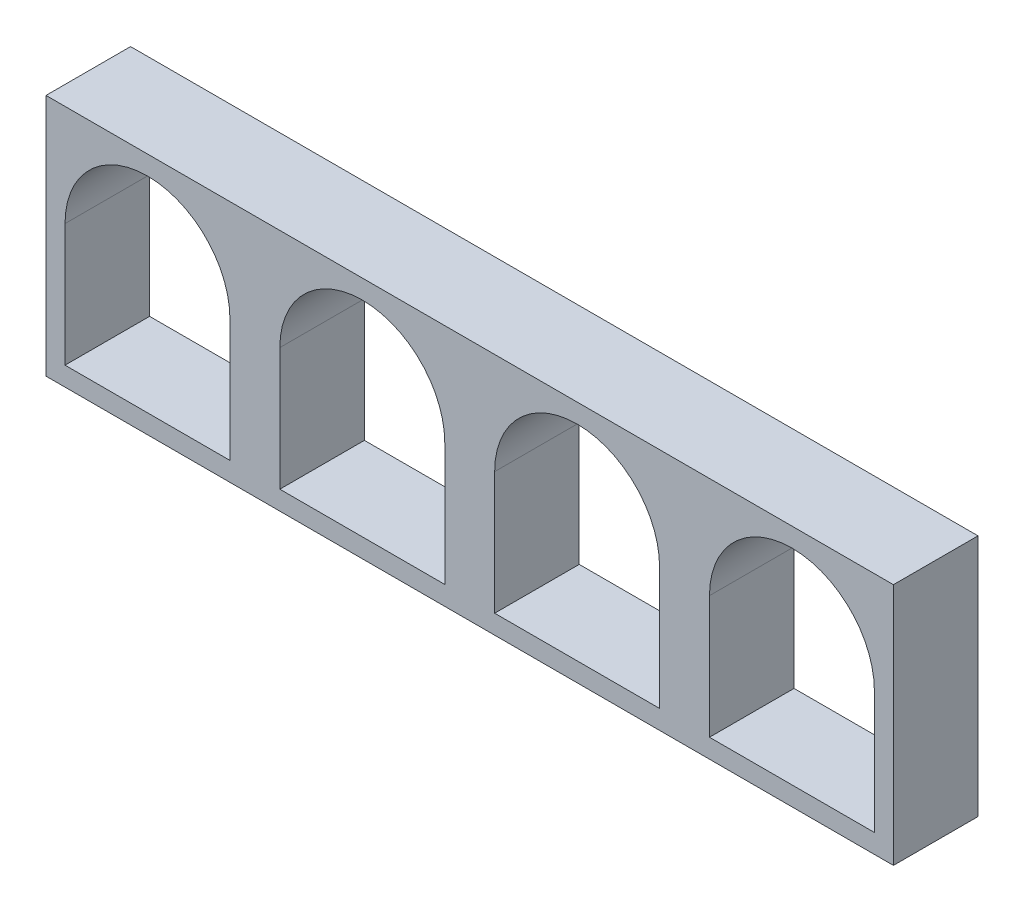
ISO-10303-21;
HEADER;
FILE_DESCRIPTION(('STEP AP214'),'2;1');
FILE_NAME('part.step','',(''),(''),'','','');
FILE_SCHEMA(('AUTOMOTIVE_DESIGN { 1 0 10303 214 1 1 1 1 }'));
ENDSEC;
DATA;
#1=APPLICATION_CONTEXT('core data for automotive mechanical design processes');
#2=APPLICATION_PROTOCOL_DEFINITION('international standard','automotive_design',2000,#1);
#3=PRODUCT_CONTEXT('',#1,'mechanical');
#4=PRODUCT('Part','Part','',(#3));
#5=PRODUCT_RELATED_PRODUCT_CATEGORY('part','',(#4));
#6=PRODUCT_DEFINITION_FORMATION('','',#4);
#7=PRODUCT_DEFINITION_CONTEXT('part definition',#1,'design');
#8=PRODUCT_DEFINITION('design','',#6,#7);
#9=PRODUCT_DEFINITION_SHAPE('','',#8);
#10=(LENGTH_UNIT() NAMED_UNIT(*) SI_UNIT(.MILLI.,.METRE.));
#11=(NAMED_UNIT(*) PLANE_ANGLE_UNIT() SI_UNIT($,.RADIAN.));
#12=(NAMED_UNIT(*) SI_UNIT($,.STERADIAN.) SOLID_ANGLE_UNIT());
#13=UNCERTAINTY_MEASURE_WITH_UNIT(LENGTH_MEASURE(1.E-05),#10,'distance_accuracy_value','');
#14=(GEOMETRIC_REPRESENTATION_CONTEXT(3) GLOBAL_UNCERTAINTY_ASSIGNED_CONTEXT((#13)) GLOBAL_UNIT_ASSIGNED_CONTEXT((#10,
#11,#12)) REPRESENTATION_CONTEXT('',''));
#15=CARTESIAN_POINT('',(0.,0.,0.));
#16=DIRECTION('',(0.,0.,1.));
#17=DIRECTION('',(1.,0.,0.));
#18=AXIS2_PLACEMENT_3D('',#15,#16,#17);
#19=CARTESIAN_POINT('',(0.,0.,10.));
#20=DIRECTION('',(0.,0.,1.));
#21=DIRECTION('',(1.,0.,0.));
#22=AXIS2_PLACEMENT_3D('',#19,#20,#21);
#23=PLANE('',#22);
#24=DIRECTION('',(0.,-1.,0.));
#25=VECTOR('',#24,1.);
#26=CARTESIAN_POINT('',(-12.,12.,10.));
#27=LINE('',#26,#25);
#28=CARTESIAN_POINT('',(-12.,12.,10.));
#29=VERTEX_POINT('',#28);
#30=CARTESIAN_POINT('',(-12.,-16.75,10.));
#31=VERTEX_POINT('',#30);
#32=EDGE_CURVE('E302',#29,#31,#27,.T.);
#33=ORIENTED_EDGE('',*,*,#32,.T.);
#34=DIRECTION('',(1.,0.,0.));
#35=VECTOR('',#34,1.);
#36=CARTESIAN_POINT('',(-12.,-16.75,10.));
#37=LINE('',#36,#35);
#38=CARTESIAN_POINT('',(88.2,-16.75,10.));
#39=VERTEX_POINT('',#38);
#40=EDGE_CURVE('E306',#31,#39,#37,.T.);
#41=ORIENTED_EDGE('',*,*,#40,.T.);
#42=DIRECTION('',(0.,1.,0.));
#43=VECTOR('',#42,1.);
#44=CARTESIAN_POINT('',(88.2,12.,10.));
#45=LINE('',#44,#43);
#46=CARTESIAN_POINT('',(88.2,12.,10.));
#47=VERTEX_POINT('',#46);
#48=EDGE_CURVE('E313',#39,#47,#45,.T.);
#49=ORIENTED_EDGE('',*,*,#48,.T.);
#50=DIRECTION('',(-1.,0.,0.));
#51=VECTOR('',#50,1.);
#52=CARTESIAN_POINT('',(-12.,12.,10.));
#53=LINE('',#52,#51);
#54=EDGE_CURVE('E311',#47,#29,#53,.T.);
#55=ORIENTED_EDGE('',*,*,#54,.T.);
#56=EDGE_LOOP('',(#33,#41,#49,#55));
#57=FACE_BOUND('',#56,.T.);
#58=DIRECTION('',(0.,1.,0.));
#59=VECTOR('',#58,1.);
#60=CARTESIAN_POINT('',(35.15,-14.5,10.));
#61=LINE('',#60,#59);
#62=CARTESIAN_POINT('',(35.15,-14.5,10.));
#63=VERTEX_POINT('',#62);
#64=CARTESIAN_POINT('',(35.15,0.,10.));
#65=VERTEX_POINT('',#64);
#66=EDGE_CURVE('E277',#63,#65,#61,.T.);
#67=ORIENTED_EDGE('',*,*,#66,.F.);
#68=DIRECTION('',(1.,0.,0.));
#69=VECTOR('',#68,1.);
#70=CARTESIAN_POINT('',(15.65,-14.5,10.));
#71=LINE('',#70,#69);
#72=CARTESIAN_POINT('',(15.65,-14.5,10.));
#73=VERTEX_POINT('',#72);
#74=EDGE_CURVE('E273',#73,#63,#71,.T.);
#75=ORIENTED_EDGE('',*,*,#74,.F.);
#76=DIRECTION('',(0.,-1.,0.));
#77=VECTOR('',#76,1.);
#78=CARTESIAN_POINT('',(15.65,-14.5,10.));
#79=LINE('',#78,#77);
#80=CARTESIAN_POINT('',(15.65,0.,10.));
#81=VERTEX_POINT('',#80);
#82=EDGE_CURVE('E285',#81,#73,#79,.T.);
#83=ORIENTED_EDGE('',*,*,#82,.F.);
#84=CARTESIAN_POINT('',(25.4,0.,10.));
#85=DIRECTION('',(0.,0.,1.));
#86=DIRECTION('',(-1.,0.,0.));
#87=AXIS2_PLACEMENT_3D('',#84,#85,#86);
#88=CIRCLE('',#87,9.75);
#89=EDGE_CURVE('E276',#65,#81,#88,.T.);
#90=ORIENTED_EDGE('',*,*,#89,.F.);
#91=EDGE_LOOP('',(#67,#75,#83,#90));
#92=FACE_BOUND('',#91,.T.);
#93=DIRECTION('',(0.,1.,0.));
#94=VECTOR('',#93,1.);
#95=CARTESIAN_POINT('',(60.55,-14.5,10.));
#96=LINE('',#95,#94);
#97=CARTESIAN_POINT('',(60.55,-14.5,10.));
#98=VERTEX_POINT('',#97);
#99=CARTESIAN_POINT('',(60.55,0.,10.));
#100=VERTEX_POINT('',#99);
#101=EDGE_CURVE('E243',#98,#100,#96,.T.);
#102=ORIENTED_EDGE('',*,*,#101,.F.);
#103=DIRECTION('',(1.,0.,0.));
#104=VECTOR('',#103,1.);
#105=CARTESIAN_POINT('',(41.05,-14.5,10.));
#106=LINE('',#105,#104);
#107=CARTESIAN_POINT('',(41.05,-14.5,10.));
#108=VERTEX_POINT('',#107);
#109=EDGE_CURVE('E244',#108,#98,#106,.T.);
#110=ORIENTED_EDGE('',*,*,#109,.F.);
#111=DIRECTION('',(0.,-1.,0.));
#112=VECTOR('',#111,1.);
#113=CARTESIAN_POINT('',(41.05,-14.5,10.));
#114=LINE('',#113,#112);
#115=CARTESIAN_POINT('',(41.05,0.,10.));
#116=VERTEX_POINT('',#115);
#117=EDGE_CURVE('E253',#116,#108,#114,.T.);
#118=ORIENTED_EDGE('',*,*,#117,.F.);
#119=CARTESIAN_POINT('',(50.8,0.,10.));
#120=DIRECTION('',(0.,0.,1.));
#121=DIRECTION('',(-1.,0.,0.));
#122=AXIS2_PLACEMENT_3D('',#119,#120,#121);
#123=CIRCLE('',#122,9.75);
#124=EDGE_CURVE('E246',#100,#116,#123,.T.);
#125=ORIENTED_EDGE('',*,*,#124,.F.);
#126=EDGE_LOOP('',(#102,#110,#118,#125));
#127=FACE_BOUND('',#126,.T.);
#128=DIRECTION('',(0.,1.,0.));
#129=VECTOR('',#128,1.);
#130=CARTESIAN_POINT('',(85.95,-14.5,10.));
#131=LINE('',#130,#129);
#132=CARTESIAN_POINT('',(85.95,-14.5,10.));
#133=VERTEX_POINT('',#132);
#134=CARTESIAN_POINT('',(85.95,0.,10.));
#135=VERTEX_POINT('',#134);
#136=EDGE_CURVE('E212',#133,#135,#131,.T.);
#137=ORIENTED_EDGE('',*,*,#136,.F.);
#138=DIRECTION('',(1.,0.,0.));
#139=VECTOR('',#138,1.);
#140=CARTESIAN_POINT('',(66.45,-14.5,10.));
#141=LINE('',#140,#139);
#142=CARTESIAN_POINT('',(66.45,-14.5,10.));
#143=VERTEX_POINT('',#142);
#144=EDGE_CURVE('E215',#143,#133,#141,.T.);
#145=ORIENTED_EDGE('',*,*,#144,.F.);
#146=DIRECTION('',(0.,-1.,0.));
#147=VECTOR('',#146,1.);
#148=CARTESIAN_POINT('',(66.45,-14.5,10.));
#149=LINE('',#148,#147);
#150=CARTESIAN_POINT('',(66.45,0.,10.));
#151=VERTEX_POINT('',#150);
#152=EDGE_CURVE('E219',#151,#143,#149,.T.);
#153=ORIENTED_EDGE('',*,*,#152,.F.);
#154=CARTESIAN_POINT('',(76.2,0.,10.));
#155=DIRECTION('',(0.,0.,1.));
#156=DIRECTION('',(-1.,0.,0.));
#157=AXIS2_PLACEMENT_3D('',#154,#155,#156);
#158=CIRCLE('',#157,9.74999999999999);
#159=EDGE_CURVE('E220',#135,#151,#158,.T.);
#160=ORIENTED_EDGE('',*,*,#159,.F.);
#161=EDGE_LOOP('',(#137,#145,#153,#160));
#162=FACE_BOUND('',#161,.T.);
#163=DIRECTION('',(0.,1.,0.));
#164=VECTOR('',#163,1.);
#165=CARTESIAN_POINT('',(9.75000000000001,-14.5,10.));
#166=LINE('',#165,#164);
#167=CARTESIAN_POINT('',(9.75000000000001,-14.5,10.));
#168=VERTEX_POINT('',#167);
#169=CARTESIAN_POINT('',(9.75,0.,10.));
#170=VERTEX_POINT('',#169);
#171=EDGE_CURVE('E184',#168,#170,#166,.T.);
#172=ORIENTED_EDGE('',*,*,#171,.F.);
#173=DIRECTION('',(1.,0.,0.));
#174=VECTOR('',#173,1.);
#175=CARTESIAN_POINT('',(-9.74999999999999,-14.5,10.));
#176=LINE('',#175,#174);
#177=CARTESIAN_POINT('',(-9.74999999999999,-14.5,10.));
#178=VERTEX_POINT('',#177);
#179=EDGE_CURVE('E178',#178,#168,#176,.T.);
#180=ORIENTED_EDGE('',*,*,#179,.F.);
#181=DIRECTION('',(0.,-1.,0.));
#182=VECTOR('',#181,1.);
#183=CARTESIAN_POINT('',(-9.74999999999999,-14.5,10.));
#184=LINE('',#183,#182);
#185=CARTESIAN_POINT('',(-9.75,0.,10.));
#186=VERTEX_POINT('',#185);
#187=EDGE_CURVE('E196',#186,#178,#184,.T.);
#188=ORIENTED_EDGE('',*,*,#187,.F.);
#189=CARTESIAN_POINT('',(0.,0.,10.));
#190=DIRECTION('',(0.,0.,1.));
#191=DIRECTION('',(-1.,0.,0.));
#192=AXIS2_PLACEMENT_3D('',#189,#190,#191);
#193=CIRCLE('',#192,9.75);
#194=EDGE_CURVE('E198',#170,#186,#193,.T.);
#195=ORIENTED_EDGE('',*,*,#194,.F.);
#196=EDGE_LOOP('',(#172,#180,#188,#195));
#197=FACE_BOUND('',#196,.T.);
#198=ADVANCED_FACE('F39',(#57,#92,#127,#162,#197),#23,.T.);
#199=CARTESIAN_POINT('',(0.,0.,0.));
#200=DIRECTION('',(0.,0.,1.));
#201=DIRECTION('',(1.,0.,0.));
#202=AXIS2_PLACEMENT_3D('',#199,#200,#201);
#203=PLANE('',#202);
#204=DIRECTION('',(1.,0.,0.));
#205=VECTOR('',#204,1.);
#206=CARTESIAN_POINT('',(66.45,-14.5,0.));
#207=LINE('',#206,#205);
#208=CARTESIAN_POINT('',(66.45,-14.5,0.));
#209=VERTEX_POINT('',#208);
#210=CARTESIAN_POINT('',(85.95,-14.5,0.));
#211=VERTEX_POINT('',#210);
#212=EDGE_CURVE('E195',#209,#211,#207,.T.);
#213=ORIENTED_EDGE('',*,*,#212,.T.);
#214=DIRECTION('',(0.,1.,0.));
#215=VECTOR('',#214,1.);
#216=CARTESIAN_POINT('',(85.95,-14.5,0.));
#217=LINE('',#216,#215);
#218=CARTESIAN_POINT('',(85.95,0.,0.));
#219=VERTEX_POINT('',#218);
#220=EDGE_CURVE('E223',#211,#219,#217,.T.);
#221=ORIENTED_EDGE('',*,*,#220,.T.);
#222=CARTESIAN_POINT('',(76.2,0.,0.));
#223=DIRECTION('',(0.,0.,1.));
#224=DIRECTION('',(-1.,0.,0.));
#225=AXIS2_PLACEMENT_3D('',#222,#223,#224);
#226=CIRCLE('',#225,9.74999999999999);
#227=CARTESIAN_POINT('',(66.45,0.,0.));
#228=VERTEX_POINT('',#227);
#229=EDGE_CURVE('E229',#219,#228,#226,.T.);
#230=ORIENTED_EDGE('',*,*,#229,.T.);
#231=DIRECTION('',(0.,-1.,0.));
#232=VECTOR('',#231,1.);
#233=CARTESIAN_POINT('',(66.45,-14.5,0.));
#234=LINE('',#233,#232);
#235=EDGE_CURVE('E214',#228,#209,#234,.T.);
#236=ORIENTED_EDGE('',*,*,#235,.T.);
#237=EDGE_LOOP('',(#213,#221,#230,#236));
#238=FACE_BOUND('',#237,.T.);
#239=DIRECTION('',(1.,0.,0.));
#240=VECTOR('',#239,1.);
#241=CARTESIAN_POINT('',(15.65,-14.5,0.));
#242=LINE('',#241,#240);
#243=CARTESIAN_POINT('',(15.65,-14.5,0.));
#244=VERTEX_POINT('',#243);
#245=CARTESIAN_POINT('',(35.15,-14.5,0.));
#246=VERTEX_POINT('',#245);
#247=EDGE_CURVE('E272',#244,#246,#242,.T.);
#248=ORIENTED_EDGE('',*,*,#247,.T.);
#249=DIRECTION('',(0.,1.,0.));
#250=VECTOR('',#249,1.);
#251=CARTESIAN_POINT('',(35.15,-14.5,0.));
#252=LINE('',#251,#250);
#253=CARTESIAN_POINT('',(35.15,0.,0.));
#254=VERTEX_POINT('',#253);
#255=EDGE_CURVE('E290',#246,#254,#252,.T.);
#256=ORIENTED_EDGE('',*,*,#255,.T.);
#257=CARTESIAN_POINT('',(25.4,0.,0.));
#258=DIRECTION('',(0.,0.,1.));
#259=DIRECTION('',(-1.,0.,0.));
#260=AXIS2_PLACEMENT_3D('',#257,#258,#259);
#261=CIRCLE('',#260,9.75);
#262=CARTESIAN_POINT('',(15.65,0.,0.));
#263=VERTEX_POINT('',#262);
#264=EDGE_CURVE('E287',#254,#263,#261,.T.);
#265=ORIENTED_EDGE('',*,*,#264,.T.);
#266=DIRECTION('',(0.,-1.,0.));
#267=VECTOR('',#266,1.);
#268=CARTESIAN_POINT('',(15.65,-14.5,0.));
#269=LINE('',#268,#267);
#270=EDGE_CURVE('E280',#263,#244,#269,.T.);
#271=ORIENTED_EDGE('',*,*,#270,.T.);
#272=EDGE_LOOP('',(#248,#256,#265,#271));
#273=FACE_BOUND('',#272,.T.);
#274=DIRECTION('',(0.,-1.,0.));
#275=VECTOR('',#274,1.);
#276=CARTESIAN_POINT('',(-12.,12.,0.));
#277=LINE('',#276,#275);
#278=CARTESIAN_POINT('',(-12.,12.,0.));
#279=VERTEX_POINT('',#278);
#280=CARTESIAN_POINT('',(-12.,-16.75,0.));
#281=VERTEX_POINT('',#280);
#282=EDGE_CURVE('E304',#279,#281,#277,.T.);
#283=ORIENTED_EDGE('',*,*,#282,.F.);
#284=DIRECTION('',(-1.,0.,0.));
#285=VECTOR('',#284,1.);
#286=CARTESIAN_POINT('',(-12.,12.,0.));
#287=LINE('',#286,#285);
#288=CARTESIAN_POINT('',(88.2,12.,0.));
#289=VERTEX_POINT('',#288);
#290=EDGE_CURVE('E310',#289,#279,#287,.T.);
#291=ORIENTED_EDGE('',*,*,#290,.F.);
#292=DIRECTION('',(0.,1.,0.));
#293=VECTOR('',#292,1.);
#294=CARTESIAN_POINT('',(88.2,12.,0.));
#295=LINE('',#294,#293);
#296=CARTESIAN_POINT('',(88.2,-16.75,0.));
#297=VERTEX_POINT('',#296);
#298=EDGE_CURVE('E319',#297,#289,#295,.T.);
#299=ORIENTED_EDGE('',*,*,#298,.F.);
#300=DIRECTION('',(1.,0.,0.));
#301=VECTOR('',#300,1.);
#302=CARTESIAN_POINT('',(-12.,-16.75,0.));
#303=LINE('',#302,#301);
#304=EDGE_CURVE('E318',#281,#297,#303,.T.);
#305=ORIENTED_EDGE('',*,*,#304,.F.);
#306=EDGE_LOOP('',(#283,#291,#299,#305));
#307=FACE_BOUND('',#306,.T.);
#308=DIRECTION('',(1.,0.,0.));
#309=VECTOR('',#308,1.);
#310=CARTESIAN_POINT('',(41.05,-14.5,0.));
#311=LINE('',#310,#309);
#312=CARTESIAN_POINT('',(41.05,-14.5,0.));
#313=VERTEX_POINT('',#312);
#314=CARTESIAN_POINT('',(60.55,-14.5,0.));
#315=VERTEX_POINT('',#314);
#316=EDGE_CURVE('E245',#313,#315,#311,.T.);
#317=ORIENTED_EDGE('',*,*,#316,.T.);
#318=DIRECTION('',(0.,1.,0.));
#319=VECTOR('',#318,1.);
#320=CARTESIAN_POINT('',(60.55,-14.5,0.));
#321=LINE('',#320,#319);
#322=CARTESIAN_POINT('',(60.55,0.,0.));
#323=VERTEX_POINT('',#322);
#324=EDGE_CURVE('E258',#315,#323,#321,.T.);
#325=ORIENTED_EDGE('',*,*,#324,.T.);
#326=CARTESIAN_POINT('',(50.8,0.,0.));
#327=DIRECTION('',(0.,0.,1.));
#328=DIRECTION('',(-1.,0.,0.));
#329=AXIS2_PLACEMENT_3D('',#326,#327,#328);
#330=CIRCLE('',#329,9.75);
#331=CARTESIAN_POINT('',(41.05,0.,0.));
#332=VERTEX_POINT('',#331);
#333=EDGE_CURVE('E259',#323,#332,#330,.T.);
#334=ORIENTED_EDGE('',*,*,#333,.T.);
#335=DIRECTION('',(0.,-1.,0.));
#336=VECTOR('',#335,1.);
#337=CARTESIAN_POINT('',(41.05,-14.5,0.));
#338=LINE('',#337,#336);
#339=EDGE_CURVE('E248',#332,#313,#338,.T.);
#340=ORIENTED_EDGE('',*,*,#339,.T.);
#341=EDGE_LOOP('',(#317,#325,#334,#340));
#342=FACE_BOUND('',#341,.T.);
#343=DIRECTION('',(1.,0.,0.));
#344=VECTOR('',#343,1.);
#345=CARTESIAN_POINT('',(-9.74999999999999,-14.5,0.));
#346=LINE('',#345,#344);
#347=CARTESIAN_POINT('',(-9.74999999999999,-14.5,0.));
#348=VERTEX_POINT('',#347);
#349=CARTESIAN_POINT('',(9.75000000000001,-14.5,0.));
#350=VERTEX_POINT('',#349);
#351=EDGE_CURVE('E65',#348,#350,#346,.T.);
#352=ORIENTED_EDGE('',*,*,#351,.T.);
#353=DIRECTION('',(0.,1.,0.));
#354=VECTOR('',#353,1.);
#355=CARTESIAN_POINT('',(9.75000000000001,-14.5,0.));
#356=LINE('',#355,#354);
#357=CARTESIAN_POINT('',(9.75,0.,0.));
#358=VERTEX_POINT('',#357);
#359=EDGE_CURVE('E193',#350,#358,#356,.T.);
#360=ORIENTED_EDGE('',*,*,#359,.T.);
#361=CARTESIAN_POINT('',(0.,0.,0.));
#362=DIRECTION('',(0.,0.,1.));
#363=DIRECTION('',(-1.,0.,0.));
#364=AXIS2_PLACEMENT_3D('',#361,#362,#363);
#365=CIRCLE('',#364,9.75);
#366=CARTESIAN_POINT('',(-9.75,0.,0.));
#367=VERTEX_POINT('',#366);
#368=EDGE_CURVE('E204',#358,#367,#365,.T.);
#369=ORIENTED_EDGE('',*,*,#368,.T.);
#370=DIRECTION('',(0.,-1.,0.));
#371=VECTOR('',#370,1.);
#372=CARTESIAN_POINT('',(-9.74999999999999,-14.5,0.));
#373=LINE('',#372,#371);
#374=EDGE_CURVE('E183',#367,#348,#373,.T.);
#375=ORIENTED_EDGE('',*,*,#374,.T.);
#376=EDGE_LOOP('',(#352,#360,#369,#375));
#377=FACE_BOUND('',#376,.T.);
#378=ADVANCED_FACE('F339',(#238,#273,#307,#342,#377),#203,.F.);
#379=CARTESIAN_POINT('',(-12.,12.,10.));
#380=DIRECTION('',(1.,0.,0.));
#381=DIRECTION('',(0.,1.,0.));
#382=AXIS2_PLACEMENT_3D('',#379,#380,#381);
#383=PLANE('',#382);
#384=ORIENTED_EDGE('',*,*,#282,.T.);
#385=DIRECTION('',(0.,0.,-1.));
#386=VECTOR('',#385,1.);
#387=CARTESIAN_POINT('',(-12.,-16.75,10.));
#388=LINE('',#387,#386);
#389=EDGE_CURVE('E11',#31,#281,#388,.T.);
#390=ORIENTED_EDGE('',*,*,#389,.F.);
#391=ORIENTED_EDGE('',*,*,#32,.F.);
#392=DIRECTION('',(0.,0.,-1.));
#393=VECTOR('',#392,1.);
#394=CARTESIAN_POINT('',(-12.,12.,10.));
#395=LINE('',#394,#393);
#396=EDGE_CURVE('E312',#29,#279,#395,.T.);
#397=ORIENTED_EDGE('',*,*,#396,.T.);
#398=EDGE_LOOP('',(#384,#390,#391,#397));
#399=FACE_BOUND('',#398,.T.);
#400=ADVANCED_FACE('F41',(#399),#383,.F.);
#401=CARTESIAN_POINT('',(-12.,-16.75,10.));
#402=DIRECTION('',(0.,1.,0.));
#403=DIRECTION('',(0.,0.,1.));
#404=AXIS2_PLACEMENT_3D('',#401,#402,#403);
#405=PLANE('',#404);
#406=ORIENTED_EDGE('',*,*,#304,.T.);
#407=DIRECTION('',(0.,0.,-1.));
#408=VECTOR('',#407,1.);
#409=CARTESIAN_POINT('',(88.2,-16.75,10.));
#410=LINE('',#409,#408);
#411=EDGE_CURVE('E50',#39,#297,#410,.T.);
#412=ORIENTED_EDGE('',*,*,#411,.F.);
#413=ORIENTED_EDGE('',*,*,#40,.F.);
#414=ORIENTED_EDGE('',*,*,#389,.T.);
#415=EDGE_LOOP('',(#406,#412,#413,#414));
#416=FACE_BOUND('',#415,.T.);
#417=ADVANCED_FACE('F349',(#416),#405,.F.);
#418=CARTESIAN_POINT('',(88.2,12.,10.));
#419=DIRECTION('',(-1.,0.,0.));
#420=DIRECTION('',(0.,0.,1.));
#421=AXIS2_PLACEMENT_3D('',#418,#419,#420);
#422=PLANE('',#421);
#423=ORIENTED_EDGE('',*,*,#298,.T.);
#424=DIRECTION('',(0.,0.,-1.));
#425=VECTOR('',#424,1.);
#426=CARTESIAN_POINT('',(88.2,12.,10.));
#427=LINE('',#426,#425);
#428=EDGE_CURVE('E324',#47,#289,#427,.T.);
#429=ORIENTED_EDGE('',*,*,#428,.F.);
#430=ORIENTED_EDGE('',*,*,#48,.F.);
#431=ORIENTED_EDGE('',*,*,#411,.T.);
#432=EDGE_LOOP('',(#423,#429,#430,#431));
#433=FACE_BOUND('',#432,.T.);
#434=ADVANCED_FACE('F335',(#433),#422,.F.);
#435=CARTESIAN_POINT('',(-12.,12.,10.));
#436=DIRECTION('',(0.,-1.,0.));
#437=DIRECTION('',(0.,0.,-1.));
#438=AXIS2_PLACEMENT_3D('',#435,#436,#437);
#439=PLANE('',#438);
#440=ORIENTED_EDGE('',*,*,#290,.T.);
#441=ORIENTED_EDGE('',*,*,#396,.F.);
#442=ORIENTED_EDGE('',*,*,#54,.F.);
#443=ORIENTED_EDGE('',*,*,#428,.T.);
#444=EDGE_LOOP('',(#440,#441,#442,#443));
#445=FACE_BOUND('',#444,.T.);
#446=ADVANCED_FACE('F345',(#445),#439,.F.);
#447=CARTESIAN_POINT('',(15.65,-14.5,10.));
#448=DIRECTION('',(0.,1.,0.));
#449=DIRECTION('',(-1.,0.,0.));
#450=AXIS2_PLACEMENT_3D('',#447,#448,#449);
#451=PLANE('',#450);
#452=ORIENTED_EDGE('',*,*,#247,.F.);
#453=DIRECTION('',(0.,0.,-1.));
#454=VECTOR('',#453,1.);
#455=CARTESIAN_POINT('',(15.65,-14.5,10.));
#456=LINE('',#455,#454);
#457=EDGE_CURVE('E281',#73,#244,#456,.T.);
#458=ORIENTED_EDGE('',*,*,#457,.F.);
#459=ORIENTED_EDGE('',*,*,#74,.T.);
#460=DIRECTION('',(0.,0.,-1.));
#461=VECTOR('',#460,1.);
#462=CARTESIAN_POINT('',(35.15,-14.5,10.));
#463=LINE('',#462,#461);
#464=EDGE_CURVE('E303',#63,#246,#463,.T.);
#465=ORIENTED_EDGE('',*,*,#464,.T.);
#466=EDGE_LOOP('',(#452,#458,#459,#465));
#467=FACE_BOUND('',#466,.T.);
#468=ADVANCED_FACE('F365',(#467),#451,.T.);
#469=CARTESIAN_POINT('',(35.15,-14.5,10.));
#470=DIRECTION('',(-1.,0.,0.));
#471=DIRECTION('',(0.,0.,1.));
#472=AXIS2_PLACEMENT_3D('',#469,#470,#471);
#473=PLANE('',#472);
#474=ORIENTED_EDGE('',*,*,#255,.F.);
#475=ORIENTED_EDGE('',*,*,#464,.F.);
#476=ORIENTED_EDGE('',*,*,#66,.T.);
#477=DIRECTION('',(0.,0.,-1.));
#478=VECTOR('',#477,1.);
#479=CARTESIAN_POINT('',(35.15,0.,10.));
#480=LINE('',#479,#478);
#481=EDGE_CURVE('E296',#65,#254,#480,.T.);
#482=ORIENTED_EDGE('',*,*,#481,.T.);
#483=EDGE_LOOP('',(#474,#475,#476,#482));
#484=FACE_BOUND('',#483,.T.);
#485=ADVANCED_FACE('F371',(#484),#473,.T.);
#486=CARTESIAN_POINT('',(25.4,0.,10.));
#487=DIRECTION('',(0.,0.,-1.));
#488=DIRECTION('',(-1.,0.,0.));
#489=AXIS2_PLACEMENT_3D('',#486,#487,#488);
#490=CYLINDRICAL_SURFACE('',#489,9.75);
#491=ORIENTED_EDGE('',*,*,#264,.F.);
#492=ORIENTED_EDGE('',*,*,#481,.F.);
#493=ORIENTED_EDGE('',*,*,#89,.T.);
#494=DIRECTION('',(0.,0.,-1.));
#495=VECTOR('',#494,1.);
#496=CARTESIAN_POINT('',(15.65,0.,10.));
#497=LINE('',#496,#495);
#498=EDGE_CURVE('E300',#81,#263,#497,.T.);
#499=ORIENTED_EDGE('',*,*,#498,.T.);
#500=EDGE_LOOP('',(#491,#492,#493,#499));
#501=FACE_BOUND('',#500,.T.);
#502=ADVANCED_FACE('F376',(#501),#490,.F.);
#503=CARTESIAN_POINT('',(15.65,-14.5,10.));
#504=DIRECTION('',(1.,0.,0.));
#505=DIRECTION('',(0.,1.,0.));
#506=AXIS2_PLACEMENT_3D('',#503,#504,#505);
#507=PLANE('',#506);
#508=ORIENTED_EDGE('',*,*,#270,.F.);
#509=ORIENTED_EDGE('',*,*,#498,.F.);
#510=ORIENTED_EDGE('',*,*,#82,.T.);
#511=ORIENTED_EDGE('',*,*,#457,.T.);
#512=EDGE_LOOP('',(#508,#509,#510,#511));
#513=FACE_BOUND('',#512,.T.);
#514=ADVANCED_FACE('F383',(#513),#507,.T.);
#515=CARTESIAN_POINT('',(41.05,-14.5,10.));
#516=DIRECTION('',(0.,1.,0.));
#517=DIRECTION('',(-1.,0.,0.));
#518=AXIS2_PLACEMENT_3D('',#515,#516,#517);
#519=PLANE('',#518);
#520=ORIENTED_EDGE('',*,*,#316,.F.);
#521=DIRECTION('',(0.,0.,-1.));
#522=VECTOR('',#521,1.);
#523=CARTESIAN_POINT('',(41.05,-14.5,10.));
#524=LINE('',#523,#522);
#525=EDGE_CURVE('E251',#108,#313,#524,.T.);
#526=ORIENTED_EDGE('',*,*,#525,.F.);
#527=ORIENTED_EDGE('',*,*,#109,.T.);
#528=DIRECTION('',(0.,0.,-1.));
#529=VECTOR('',#528,1.);
#530=CARTESIAN_POINT('',(60.55,-14.5,10.));
#531=LINE('',#530,#529);
#532=EDGE_CURVE('E269',#98,#315,#531,.T.);
#533=ORIENTED_EDGE('',*,*,#532,.T.);
#534=EDGE_LOOP('',(#520,#526,#527,#533));
#535=FACE_BOUND('',#534,.T.);
#536=ADVANCED_FACE('F437',(#535),#519,.T.);
#537=CARTESIAN_POINT('',(60.55,-14.5,10.));
#538=DIRECTION('',(-1.,0.,0.));
#539=DIRECTION('',(0.,-1.,0.));
#540=AXIS2_PLACEMENT_3D('',#537,#538,#539);
#541=PLANE('',#540);
#542=ORIENTED_EDGE('',*,*,#324,.F.);
#543=ORIENTED_EDGE('',*,*,#532,.F.);
#544=ORIENTED_EDGE('',*,*,#101,.T.);
#545=DIRECTION('',(0.,0.,-1.));
#546=VECTOR('',#545,1.);
#547=CARTESIAN_POINT('',(60.55,0.,10.));
#548=LINE('',#547,#546);
#549=EDGE_CURVE('E268',#100,#323,#548,.T.);
#550=ORIENTED_EDGE('',*,*,#549,.T.);
#551=EDGE_LOOP('',(#542,#543,#544,#550));
#552=FACE_BOUND('',#551,.T.);
#553=ADVANCED_FACE('F432',(#552),#541,.T.);
#554=CARTESIAN_POINT('',(50.8,0.,10.));
#555=DIRECTION('',(0.,0.,-1.));
#556=DIRECTION('',(-1.,0.,0.));
#557=AXIS2_PLACEMENT_3D('',#554,#555,#556);
#558=CYLINDRICAL_SURFACE('',#557,9.75);
#559=ORIENTED_EDGE('',*,*,#333,.F.);
#560=ORIENTED_EDGE('',*,*,#549,.F.);
#561=ORIENTED_EDGE('',*,*,#124,.T.);
#562=DIRECTION('',(0.,0.,-1.));
#563=VECTOR('',#562,1.);
#564=CARTESIAN_POINT('',(41.05,0.,10.));
#565=LINE('',#564,#563);
#566=EDGE_CURVE('E266',#116,#332,#565,.T.);
#567=ORIENTED_EDGE('',*,*,#566,.T.);
#568=EDGE_LOOP('',(#559,#560,#561,#567));
#569=FACE_BOUND('',#568,.T.);
#570=ADVANCED_FACE('F429',(#569),#558,.F.);
#571=CARTESIAN_POINT('',(41.05,-14.5,10.));
#572=DIRECTION('',(1.,0.,0.));
#573=DIRECTION('',(0.,0.,-1.));
#574=AXIS2_PLACEMENT_3D('',#571,#572,#573);
#575=PLANE('',#574);
#576=ORIENTED_EDGE('',*,*,#339,.F.);
#577=ORIENTED_EDGE('',*,*,#566,.F.);
#578=ORIENTED_EDGE('',*,*,#117,.T.);
#579=ORIENTED_EDGE('',*,*,#525,.T.);
#580=EDGE_LOOP('',(#576,#577,#578,#579));
#581=FACE_BOUND('',#580,.T.);
#582=ADVANCED_FACE('F430',(#581),#575,.T.);
#583=CARTESIAN_POINT('',(66.45,-14.5,10.));
#584=DIRECTION('',(0.,1.,0.));
#585=DIRECTION('',(-1.,0.,0.));
#586=AXIS2_PLACEMENT_3D('',#583,#584,#585);
#587=PLANE('',#586);
#588=ORIENTED_EDGE('',*,*,#212,.F.);
#589=DIRECTION('',(0.,0.,-1.));
#590=VECTOR('',#589,1.);
#591=CARTESIAN_POINT('',(66.45,-14.5,10.));
#592=LINE('',#591,#590);
#593=EDGE_CURVE('E225',#143,#209,#592,.T.);
#594=ORIENTED_EDGE('',*,*,#593,.F.);
#595=ORIENTED_EDGE('',*,*,#144,.T.);
#596=DIRECTION('',(0.,0.,-1.));
#597=VECTOR('',#596,1.);
#598=CARTESIAN_POINT('',(85.95,-14.5,10.));
#599=LINE('',#598,#597);
#600=EDGE_CURVE('E239',#133,#211,#599,.T.);
#601=ORIENTED_EDGE('',*,*,#600,.T.);
#602=EDGE_LOOP('',(#588,#594,#595,#601));
#603=FACE_BOUND('',#602,.T.);
#604=ADVANCED_FACE('F406',(#603),#587,.T.);
#605=CARTESIAN_POINT('',(85.95,-14.5,10.));
#606=DIRECTION('',(-1.,0.,0.));
#607=DIRECTION('',(0.,-1.,0.));
#608=AXIS2_PLACEMENT_3D('',#605,#606,#607);
#609=PLANE('',#608);
#610=ORIENTED_EDGE('',*,*,#220,.F.);
#611=ORIENTED_EDGE('',*,*,#600,.F.);
#612=ORIENTED_EDGE('',*,*,#136,.T.);
#613=DIRECTION('',(0.,0.,-1.));
#614=VECTOR('',#613,1.);
#615=CARTESIAN_POINT('',(85.95,0.,10.));
#616=LINE('',#615,#614);
#617=EDGE_CURVE('E240',#135,#219,#616,.T.);
#618=ORIENTED_EDGE('',*,*,#617,.T.);
#619=EDGE_LOOP('',(#610,#611,#612,#618));
#620=FACE_BOUND('',#619,.T.);
#621=ADVANCED_FACE('F401',(#620),#609,.T.);
#622=CARTESIAN_POINT('',(76.2,0.,10.));
#623=DIRECTION('',(0.,0.,-1.));
#624=DIRECTION('',(-1.,0.,0.));
#625=AXIS2_PLACEMENT_3D('',#622,#623,#624);
#626=CYLINDRICAL_SURFACE('',#625,9.74999999999999);
#627=ORIENTED_EDGE('',*,*,#229,.F.);
#628=ORIENTED_EDGE('',*,*,#617,.F.);
#629=ORIENTED_EDGE('',*,*,#159,.T.);
#630=DIRECTION('',(0.,0.,-1.));
#631=VECTOR('',#630,1.);
#632=CARTESIAN_POINT('',(66.45,0.,10.));
#633=LINE('',#632,#631);
#634=EDGE_CURVE('E232',#151,#228,#633,.T.);
#635=ORIENTED_EDGE('',*,*,#634,.T.);
#636=EDGE_LOOP('',(#627,#628,#629,#635));
#637=FACE_BOUND('',#636,.T.);
#638=ADVANCED_FACE('F407',(#637),#626,.F.);
#639=CARTESIAN_POINT('',(66.45,-14.5,10.));
#640=DIRECTION('',(1.,0.,0.));
#641=DIRECTION('',(0.,0.,-1.));
#642=AXIS2_PLACEMENT_3D('',#639,#640,#641);
#643=PLANE('',#642);
#644=ORIENTED_EDGE('',*,*,#235,.F.);
#645=ORIENTED_EDGE('',*,*,#634,.F.);
#646=ORIENTED_EDGE('',*,*,#152,.T.);
#647=ORIENTED_EDGE('',*,*,#593,.T.);
#648=EDGE_LOOP('',(#644,#645,#646,#647));
#649=FACE_BOUND('',#648,.T.);
#650=ADVANCED_FACE('F415',(#649),#643,.T.);
#651=CARTESIAN_POINT('',(-9.74999999999999,-14.5,10.));
#652=DIRECTION('',(0.,1.,0.));
#653=DIRECTION('',(-1.,0.,0.));
#654=AXIS2_PLACEMENT_3D('',#651,#652,#653);
#655=PLANE('',#654);
#656=ORIENTED_EDGE('',*,*,#351,.F.);
#657=DIRECTION('',(0.,0.,-1.));
#658=VECTOR('',#657,1.);
#659=CARTESIAN_POINT('',(-9.74999999999999,-14.5,10.));
#660=LINE('',#659,#658);
#661=EDGE_CURVE('E177',#178,#348,#660,.T.);
#662=ORIENTED_EDGE('',*,*,#661,.F.);
#663=ORIENTED_EDGE('',*,*,#179,.T.);
#664=DIRECTION('',(0.,0.,-1.));
#665=VECTOR('',#664,1.);
#666=CARTESIAN_POINT('',(9.75000000000001,-14.5,10.));
#667=LINE('',#666,#665);
#668=EDGE_CURVE('E179',#168,#350,#667,.T.);
#669=ORIENTED_EDGE('',*,*,#668,.T.);
#670=EDGE_LOOP('',(#656,#662,#663,#669));
#671=FACE_BOUND('',#670,.T.);
#672=ADVANCED_FACE('F176',(#671),#655,.T.);
#673=CARTESIAN_POINT('',(9.75000000000001,-14.5,10.));
#674=DIRECTION('',(-1.,0.,0.));
#675=DIRECTION('',(0.,-1.,0.));
#676=AXIS2_PLACEMENT_3D('',#673,#674,#675);
#677=PLANE('',#676);
#678=ORIENTED_EDGE('',*,*,#359,.F.);
#679=ORIENTED_EDGE('',*,*,#668,.F.);
#680=ORIENTED_EDGE('',*,*,#171,.T.);
#681=DIRECTION('',(0.,0.,-1.));
#682=VECTOR('',#681,1.);
#683=CARTESIAN_POINT('',(9.75,0.,10.));
#684=LINE('',#683,#682);
#685=EDGE_CURVE('E191',#170,#358,#684,.T.);
#686=ORIENTED_EDGE('',*,*,#685,.T.);
#687=EDGE_LOOP('',(#678,#679,#680,#686));
#688=FACE_BOUND('',#687,.T.);
#689=ADVANCED_FACE('F189',(#688),#677,.T.);
#690=CARTESIAN_POINT('',(0.,0.,10.));
#691=DIRECTION('',(0.,0.,-1.));
#692=DIRECTION('',(-1.,0.,0.));
#693=AXIS2_PLACEMENT_3D('',#690,#691,#692);
#694=CYLINDRICAL_SURFACE('',#693,9.75);
#695=ORIENTED_EDGE('',*,*,#368,.F.);
#696=ORIENTED_EDGE('',*,*,#685,.F.);
#697=ORIENTED_EDGE('',*,*,#194,.T.);
#698=DIRECTION('',(0.,0.,-1.));
#699=VECTOR('',#698,1.);
#700=CARTESIAN_POINT('',(-9.75,0.,10.));
#701=LINE('',#700,#699);
#702=EDGE_CURVE('E53',#186,#367,#701,.T.);
#703=ORIENTED_EDGE('',*,*,#702,.T.);
#704=EDGE_LOOP('',(#695,#696,#697,#703));
#705=FACE_BOUND('',#704,.T.);
#706=ADVANCED_FACE('F507',(#705),#694,.F.);
#707=CARTESIAN_POINT('',(-9.74999999999999,-14.5,10.));
#708=DIRECTION('',(1.,0.,0.));
#709=DIRECTION('',(0.,1.,0.));
#710=AXIS2_PLACEMENT_3D('',#707,#708,#709);
#711=PLANE('',#710);
#712=ORIENTED_EDGE('',*,*,#374,.F.);
#713=ORIENTED_EDGE('',*,*,#702,.F.);
#714=ORIENTED_EDGE('',*,*,#187,.T.);
#715=ORIENTED_EDGE('',*,*,#661,.T.);
#716=EDGE_LOOP('',(#712,#713,#714,#715));
#717=FACE_BOUND('',#716,.T.);
#718=ADVANCED_FACE('F519',(#717),#711,.T.);
#719=CLOSED_SHELL('',(#198,#378,#400,#417,#434,#446,#468,#485,#502,#514,#536,#553,#570,#582,
#604,#621,#638,#650,#672,#689,#706,#718));
#720=MANIFOLD_SOLID_BREP('B2',#719);
#721=ADVANCED_BREP_SHAPE_REPRESENTATION('',(#18,#720),#14);
#722=SHAPE_DEFINITION_REPRESENTATION(#9,#721);
ENDSEC;
END-ISO-10303-21;
